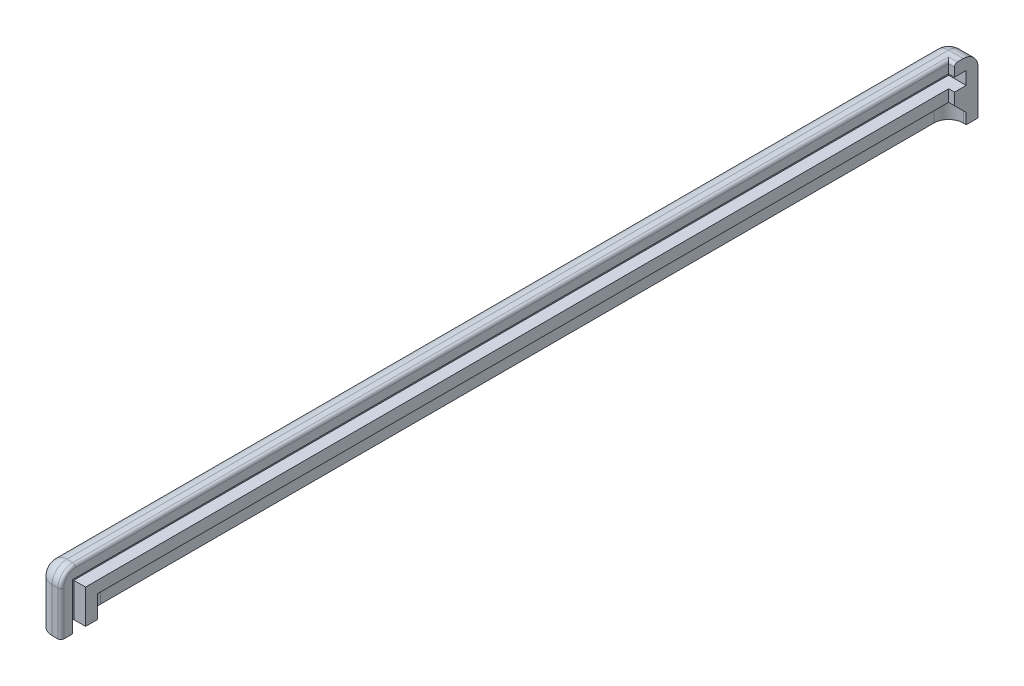
ISO-10303-21;
HEADER;
FILE_DESCRIPTION(('STEP AP214'),'2;1');
FILE_NAME('part.step','',(''),(''),'','','');
FILE_SCHEMA(('AUTOMOTIVE_DESIGN { 1 0 10303 214 1 1 1 1 }'));
ENDSEC;
DATA;
#1=APPLICATION_CONTEXT('core data for automotive mechanical design processes');
#2=APPLICATION_PROTOCOL_DEFINITION('international standard','automotive_design',2000,#1);
#3=PRODUCT_CONTEXT('',#1,'mechanical');
#4=PRODUCT('Part','Part','',(#3));
#5=PRODUCT_RELATED_PRODUCT_CATEGORY('part','',(#4));
#6=PRODUCT_DEFINITION_FORMATION('','',#4);
#7=PRODUCT_DEFINITION_CONTEXT('part definition',#1,'design');
#8=PRODUCT_DEFINITION('design','',#6,#7);
#9=PRODUCT_DEFINITION_SHAPE('','',#8);
#10=(LENGTH_UNIT() NAMED_UNIT(*) SI_UNIT(.MILLI.,.METRE.));
#11=(NAMED_UNIT(*) PLANE_ANGLE_UNIT() SI_UNIT($,.RADIAN.));
#12=(NAMED_UNIT(*) SI_UNIT($,.STERADIAN.) SOLID_ANGLE_UNIT());
#13=UNCERTAINTY_MEASURE_WITH_UNIT(LENGTH_MEASURE(1.E-05),#10,'distance_accuracy_value','');
#14=(GEOMETRIC_REPRESENTATION_CONTEXT(3) GLOBAL_UNCERTAINTY_ASSIGNED_CONTEXT((#13)) GLOBAL_UNIT_ASSIGNED_CONTEXT((#10,
#11,#12)) REPRESENTATION_CONTEXT('',''));
#15=CARTESIAN_POINT('',(0.,0.,0.));
#16=DIRECTION('',(0.,0.,1.));
#17=DIRECTION('',(1.,0.,0.));
#18=AXIS2_PLACEMENT_3D('',#15,#16,#17);
#19=CARTESIAN_POINT('',(-19.5,2.,-77.5));
#20=DIRECTION('',(0.,0.,1.));
#21=DIRECTION('',(1.,0.,0.));
#22=AXIS2_PLACEMENT_3D('',#19,#20,#21);
#23=PLANE('',#22);
#24=DIRECTION('',(1.,0.,0.));
#25=VECTOR('',#24,1.);
#26=CARTESIAN_POINT('',(-19.5,30.,-77.5));
#27=LINE('',#26,#25);
#28=CARTESIAN_POINT('',(-17.,30.,-77.5));
#29=VERTEX_POINT('',#28);
#30=CARTESIAN_POINT('',(-14.5,30.,-77.5));
#31=VERTEX_POINT('',#30);
#32=EDGE_CURVE('E96',#29,#31,#27,.T.);
#33=ORIENTED_EDGE('',*,*,#32,.F.);
#34=DIRECTION('',(0.,-1.,0.));
#35=VECTOR('',#34,1.);
#36=CARTESIAN_POINT('',(-17.,2.,-77.5));
#37=LINE('',#36,#35);
#38=CARTESIAN_POINT('',(-17.,37.5,-77.5));
#39=VERTEX_POINT('',#38);
#40=EDGE_CURVE('E266',#29,#39,#37,.F.);
#41=ORIENTED_EDGE('',*,*,#40,.T.);
#42=DIRECTION('',(-1.,0.,0.));
#43=VECTOR('',#42,1.);
#44=CARTESIAN_POINT('',(19.5,37.5,-77.5));
#45=LINE('',#44,#43);
#46=CARTESIAN_POINT('',(-14.5,37.5,-77.5));
#47=VERTEX_POINT('',#46);
#48=EDGE_CURVE('E277',#39,#47,#45,.F.);
#49=ORIENTED_EDGE('',*,*,#48,.T.);
#50=DIRECTION('',(0.,-1.,0.));
#51=VECTOR('',#50,1.);
#52=CARTESIAN_POINT('',(-14.5,2.,-77.5));
#53=LINE('',#52,#51);
#54=EDGE_CURVE('E268',#47,#31,#53,.T.);
#55=ORIENTED_EDGE('',*,*,#54,.T.);
#56=EDGE_LOOP('',(#33,#41,#49,#55));
#57=FACE_BOUND('',#56,.T.);
#58=ADVANCED_FACE('F82',(#57),#23,.F.);
#59=CARTESIAN_POINT('',(-17.5,42.8284271247462,75.5));
#60=DIRECTION('',(0.,0.,1.));
#61=DIRECTION('',(1.,0.,0.));
#62=AXIS2_PLACEMENT_3D('',#59,#60,#61);
#63=PLANE('',#62);
#64=DIRECTION('',(1.,0.,0.));
#65=VECTOR('',#64,1.);
#66=CARTESIAN_POINT('',(-17.5,30.,75.5));
#67=LINE('',#66,#65);
#68=CARTESIAN_POINT('',(-17.5,30.,75.5));
#69=VERTEX_POINT('',#68);
#70=CARTESIAN_POINT('',(-15.5,30.,75.5));
#71=VERTEX_POINT('',#70);
#72=EDGE_CURVE('E604',#69,#71,#67,.T.);
#73=ORIENTED_EDGE('',*,*,#72,.F.);
#74=DIRECTION('',(0.,-1.,0.));
#75=VECTOR('',#74,1.);
#76=CARTESIAN_POINT('',(-17.5,42.8284271247462,75.5));
#77=LINE('',#76,#75);
#78=CARTESIAN_POINT('',(-17.5,38.,75.5));
#79=VERTEX_POINT('',#78);
#80=EDGE_CURVE('E570',#79,#69,#77,.T.);
#81=ORIENTED_EDGE('',*,*,#80,.F.);
#82=DIRECTION('',(-1.,0.,0.));
#83=VECTOR('',#82,1.);
#84=CARTESIAN_POINT('',(-12.5267862505363,38.,75.5));
#85=LINE('',#84,#83);
#86=CARTESIAN_POINT('',(-15.5,38.,75.5));
#87=VERTEX_POINT('',#86);
#88=EDGE_CURVE('E322',#87,#79,#85,.T.);
#89=ORIENTED_EDGE('',*,*,#88,.F.);
#90=DIRECTION('',(0.,-1.,0.));
#91=VECTOR('',#90,1.);
#92=CARTESIAN_POINT('',(-15.5,42.8284271247462,75.5));
#93=LINE('',#92,#91);
#94=EDGE_CURVE('E571',#87,#71,#93,.T.);
#95=ORIENTED_EDGE('',*,*,#94,.T.);
#96=EDGE_LOOP('',(#73,#81,#89,#95));
#97=FACE_BOUND('',#96,.T.);
#98=ADVANCED_FACE('F417',(#97),#63,.F.);
#99=CARTESIAN_POINT('',(-19.5,2.,77.5));
#100=DIRECTION('',(0.,0.,-1.));
#101=DIRECTION('',(-1.,0.,0.));
#102=AXIS2_PLACEMENT_3D('',#99,#100,#101);
#103=PLANE('',#102);
#104=DIRECTION('',(1.,0.,0.));
#105=VECTOR('',#104,1.);
#106=CARTESIAN_POINT('',(-19.5,30.,77.5));
#107=LINE('',#106,#105);
#108=CARTESIAN_POINT('',(-17.,30.,77.5));
#109=VERTEX_POINT('',#108);
#110=CARTESIAN_POINT('',(-16.,30.,77.5));
#111=VERTEX_POINT('',#110);
#112=EDGE_CURVE('E269',#109,#111,#107,.T.);
#113=ORIENTED_EDGE('',*,*,#112,.T.);
#114=DIRECTION('',(0.,-1.,0.));
#115=VECTOR('',#114,1.);
#116=CARTESIAN_POINT('',(-16.,2.,77.5));
#117=LINE('',#116,#115);
#118=CARTESIAN_POINT('',(-16.,37.5,77.5));
#119=VERTEX_POINT('',#118);
#120=EDGE_CURVE('E90',#111,#119,#117,.F.);
#121=ORIENTED_EDGE('',*,*,#120,.T.);
#122=DIRECTION('',(1.,0.,0.));
#123=VECTOR('',#122,1.);
#124=CARTESIAN_POINT('',(-19.5,37.5,77.5));
#125=LINE('',#124,#123);
#126=CARTESIAN_POINT('',(-17.,37.5,77.5));
#127=VERTEX_POINT('',#126);
#128=EDGE_CURVE('E281',#119,#127,#125,.F.);
#129=ORIENTED_EDGE('',*,*,#128,.T.);
#130=DIRECTION('',(0.,-1.,0.));
#131=VECTOR('',#130,1.);
#132=CARTESIAN_POINT('',(-17.,2.,77.5));
#133=LINE('',#132,#131);
#134=EDGE_CURVE('E387',#127,#109,#133,.T.);
#135=ORIENTED_EDGE('',*,*,#134,.T.);
#136=EDGE_LOOP('',(#113,#121,#129,#135));
#137=FACE_BOUND('',#136,.T.);
#138=ADVANCED_FACE('F395',(#137),#103,.F.);
#139=CARTESIAN_POINT('',(-17.5,42.8284271247462,73.3));
#140=DIRECTION('',(0.,0.,-1.));
#141=DIRECTION('',(-1.,0.,0.));
#142=AXIS2_PLACEMENT_3D('',#139,#140,#141);
#143=PLANE('',#142);
#144=DIRECTION('',(-1.,0.,0.));
#145=VECTOR('',#144,1.);
#146=CARTESIAN_POINT('',(-17.5,30.,73.3));
#147=LINE('',#146,#145);
#148=CARTESIAN_POINT('',(-15.5,30.,73.3));
#149=VERTEX_POINT('',#148);
#150=CARTESIAN_POINT('',(-17.5,30.,73.3));
#151=VERTEX_POINT('',#150);
#152=EDGE_CURVE('E606',#149,#151,#147,.T.);
#153=ORIENTED_EDGE('',*,*,#152,.F.);
#154=DIRECTION('',(0.,-1.,0.));
#155=VECTOR('',#154,1.);
#156=CARTESIAN_POINT('',(-15.5,42.8284271247462,73.3));
#157=LINE('',#156,#155);
#158=CARTESIAN_POINT('',(-15.5,35.8,73.3));
#159=VERTEX_POINT('',#158);
#160=EDGE_CURVE('E567',#159,#149,#157,.T.);
#161=ORIENTED_EDGE('',*,*,#160,.F.);
#162=DIRECTION('',(-1.,0.,0.));
#163=VECTOR('',#162,1.);
#164=CARTESIAN_POINT('',(-15.5,35.8,73.3));
#165=LINE('',#164,#163);
#166=CARTESIAN_POINT('',(-17.5,35.8,73.3));
#167=VERTEX_POINT('',#166);
#168=EDGE_CURVE('E540',#159,#167,#165,.T.);
#169=ORIENTED_EDGE('',*,*,#168,.T.);
#170=DIRECTION('',(0.,-1.,0.));
#171=VECTOR('',#170,1.);
#172=CARTESIAN_POINT('',(-17.5,42.8284271247462,73.3));
#173=LINE('',#172,#171);
#174=EDGE_CURVE('E564',#167,#151,#173,.T.);
#175=ORIENTED_EDGE('',*,*,#174,.T.);
#176=EDGE_LOOP('',(#153,#161,#169,#175));
#177=FACE_BOUND('',#176,.T.);
#178=ADVANCED_FACE('F432',(#177),#143,.F.);
#179=CARTESIAN_POINT('',(0.,40.,-75.5));
#180=DIRECTION('',(0.,0.,-1.));
#181=DIRECTION('',(-1.,0.,0.));
#182=AXIS2_PLACEMENT_3D('',#179,#180,#181);
#183=PLANE('',#182);
#184=DIRECTION('',(-1.,0.,0.));
#185=VECTOR('',#184,1.);
#186=CARTESIAN_POINT('',(0.,30.,-75.5));
#187=LINE('',#186,#185);
#188=CARTESIAN_POINT('',(-14.5,30.,-75.5));
#189=VERTEX_POINT('',#188);
#190=CARTESIAN_POINT('',(-15.,30.,-75.5));
#191=VERTEX_POINT('',#190);
#192=EDGE_CURVE('E637',#189,#191,#187,.T.);
#193=ORIENTED_EDGE('',*,*,#192,.F.);
#194=DIRECTION('',(0.,1.,0.));
#195=VECTOR('',#194,1.);
#196=CARTESIAN_POINT('',(-14.5,40.,-75.5));
#197=LINE('',#196,#195);
#198=CARTESIAN_POINT('',(-14.5,31.8,-75.5));
#199=VERTEX_POINT('',#198);
#200=EDGE_CURVE('E620',#189,#199,#197,.T.);
#201=ORIENTED_EDGE('',*,*,#200,.T.);
#202=DIRECTION('',(-1.,0.,0.));
#203=VECTOR('',#202,1.);
#204=CARTESIAN_POINT('',(21.9721359549996,31.8,-75.5));
#205=LINE('',#204,#203);
#206=CARTESIAN_POINT('',(-15.,31.8,-75.5));
#207=VERTEX_POINT('',#206);
#208=EDGE_CURVE('E525',#199,#207,#205,.T.);
#209=ORIENTED_EDGE('',*,*,#208,.T.);
#210=DIRECTION('',(0.,-1.,0.));
#211=VECTOR('',#210,1.);
#212=CARTESIAN_POINT('',(-15.,40.,-75.5));
#213=LINE('',#212,#211);
#214=EDGE_CURVE('E297',#207,#191,#213,.T.);
#215=ORIENTED_EDGE('',*,*,#214,.T.);
#216=EDGE_LOOP('',(#193,#201,#209,#215));
#217=FACE_BOUND('',#216,.T.);
#218=ADVANCED_FACE('F445',(#217),#183,.F.);
#219=CARTESIAN_POINT('',(-15.,40.,-73.));
#220=DIRECTION('',(0.,-1.,0.));
#221=DIRECTION('',(0.,0.,-1.));
#222=AXIS2_PLACEMENT_3D('',#219,#220,#221);
#223=CYLINDRICAL_SURFACE('',#222,2.5);
#224=CARTESIAN_POINT('',(-15.,30.,-73.));
#225=DIRECTION('',(0.,-1.,0.));
#226=DIRECTION('',(0.,0.,-1.));
#227=AXIS2_PLACEMENT_3D('',#224,#225,#226);
#228=CIRCLE('',#227,2.5);
#229=CARTESIAN_POINT('',(-17.5,30.,-73.));
#230=VERTEX_POINT('',#229);
#231=EDGE_CURVE('E635',#191,#230,#228,.F.);
#232=ORIENTED_EDGE('',*,*,#231,.F.);
#233=ORIENTED_EDGE('',*,*,#214,.F.);
#234=CARTESIAN_POINT('',(-15.,34.3,-73.));
#235=DIRECTION('',(0.,0.707106781186546,-0.707106781186549));
#236=DIRECTION('',(0.,-0.707106781186549,-0.707106781186546));
#237=AXIS2_PLACEMENT_3D('',#234,#235,#236);
#238=ELLIPSE('',#237,3.53553390593274,2.5);
#239=CARTESIAN_POINT('',(-16.7677669529664,32.5322330470336,-74.7677669529664));
#240=VERTEX_POINT('',#239);
#241=EDGE_CURVE('E300',#240,#207,#238,.F.);
#242=ORIENTED_EDGE('',*,*,#241,.F.);
#243=CARTESIAN_POINT('',(-15.,34.3,-73.));
#244=DIRECTION('',(-0.707106781186551,0.707106781186544,0.));
#245=DIRECTION('',(-0.707106781186544,-0.707106781186551,0.));
#246=AXIS2_PLACEMENT_3D('',#243,#244,#245);
#247=ELLIPSE('',#246,3.53553390593276,2.5);
#248=CARTESIAN_POINT('',(-17.5,31.8,-73.));
#249=VERTEX_POINT('',#248);
#250=EDGE_CURVE('E293',#249,#240,#247,.F.);
#251=ORIENTED_EDGE('',*,*,#250,.F.);
#252=DIRECTION('',(0.,-1.,0.));
#253=VECTOR('',#252,1.);
#254=CARTESIAN_POINT('',(-17.5,40.,-73.));
#255=LINE('',#254,#253);
#256=EDGE_CURVE('E288',#230,#249,#255,.F.);
#257=ORIENTED_EDGE('',*,*,#256,.F.);
#258=EDGE_LOOP('',(#232,#233,#242,#251,#257));
#259=FACE_BOUND('',#258,.T.);
#260=ADVANCED_FACE('F437',(#259),#223,.F.);
#261=CARTESIAN_POINT('',(-17.5,40.,0.));
#262=DIRECTION('',(1.,0.,0.));
#263=DIRECTION('',(0.,0.,-1.));
#264=AXIS2_PLACEMENT_3D('',#261,#262,#263);
#265=PLANE('',#264);
#266=ORIENTED_EDGE('',*,*,#80,.T.);
#267=DIRECTION('',(0.,0.,-1.));
#268=VECTOR('',#267,1.);
#269=CARTESIAN_POINT('',(-17.5,30.,0.));
#270=LINE('',#269,#268);
#271=EDGE_CURVE('E605',#69,#151,#270,.T.);
#272=ORIENTED_EDGE('',*,*,#271,.T.);
#273=ORIENTED_EDGE('',*,*,#174,.F.);
#274=DIRECTION('',(0.,0.,-1.));
#275=VECTOR('',#274,1.);
#276=CARTESIAN_POINT('',(-17.5,35.8,81.9721359549996));
#277=LINE('',#276,#275);
#278=CARTESIAN_POINT('',(-17.5,35.8,-75.5));
#279=VERTEX_POINT('',#278);
#280=EDGE_CURVE('E554',#167,#279,#277,.T.);
#281=ORIENTED_EDGE('',*,*,#280,.T.);
#282=DIRECTION('',(0.,-1.,0.));
#283=VECTOR('',#282,1.);
#284=CARTESIAN_POINT('',(-17.5,40.,-75.5));
#285=LINE('',#284,#283);
#286=CARTESIAN_POINT('',(-17.5,38.,-75.5));
#287=VERTEX_POINT('',#286);
#288=EDGE_CURVE('E573',#287,#279,#285,.T.);
#289=ORIENTED_EDGE('',*,*,#288,.F.);
#290=DIRECTION('',(0.,0.,-1.));
#291=VECTOR('',#290,1.);
#292=CARTESIAN_POINT('',(-17.5,38.,81.9721359549996));
#293=LINE('',#292,#291);
#294=EDGE_CURVE('E562',#79,#287,#293,.T.);
#295=ORIENTED_EDGE('',*,*,#294,.F.);
#296=EDGE_LOOP('',(#266,#272,#273,#281,#289,#295));
#297=FACE_BOUND('',#296,.T.);
#298=ADVANCED_FACE('F433',(#297),#265,.T.);
#299=CARTESIAN_POINT('',(-15.5,42.8284271247462,77.5));
#300=DIRECTION('',(-1.,0.,0.));
#301=DIRECTION('',(0.,0.,1.));
#302=AXIS2_PLACEMENT_3D('',#299,#300,#301);
#303=PLANE('',#302);
#304=DIRECTION('',(0.,0.,1.));
#305=VECTOR('',#304,1.);
#306=CARTESIAN_POINT('',(-15.5,30.,77.5));
#307=LINE('',#306,#305);
#308=CARTESIAN_POINT('',(-15.5,30.,71.2494897427832));
#309=VERTEX_POINT('',#308);
#310=EDGE_CURVE('E610',#309,#149,#307,.T.);
#311=ORIENTED_EDGE('',*,*,#310,.F.);
#312=DIRECTION('',(0.,-1.,0.));
#313=VECTOR('',#312,1.);
#314=CARTESIAN_POINT('',(-15.5,4.,71.2494897427832));
#315=LINE('',#314,#313);
#316=CARTESIAN_POINT('',(-15.5,33.8,71.2494897427832));
#317=VERTEX_POINT('',#316);
#318=EDGE_CURVE('E303',#309,#317,#315,.F.);
#319=ORIENTED_EDGE('',*,*,#318,.T.);
#320=DIRECTION('',(0.,0.,-1.));
#321=VECTOR('',#320,1.);
#322=CARTESIAN_POINT('',(-15.5,33.8,81.9721359549996));
#323=LINE('',#322,#321);
#324=CARTESIAN_POINT('',(-15.5,33.8,-73.5));
#325=VERTEX_POINT('',#324);
#326=EDGE_CURVE('E548',#317,#325,#323,.T.);
#327=ORIENTED_EDGE('',*,*,#326,.T.);
#328=DIRECTION('',(0.,-1.,0.));
#329=VECTOR('',#328,1.);
#330=CARTESIAN_POINT('',(-15.5,42.8284271247451,-73.5000000000001));
#331=LINE('',#330,#329);
#332=CARTESIAN_POINT('',(-15.5,35.8,-73.5));
#333=VERTEX_POINT('',#332);
#334=EDGE_CURVE('E534',#333,#325,#331,.T.);
#335=ORIENTED_EDGE('',*,*,#334,.F.);
#336=DIRECTION('',(0.,0.,-1.));
#337=VECTOR('',#336,1.);
#338=CARTESIAN_POINT('',(-15.5,35.8,81.9721359549996));
#339=LINE('',#338,#337);
#340=EDGE_CURVE('E545',#159,#333,#339,.T.);
#341=ORIENTED_EDGE('',*,*,#340,.F.);
#342=ORIENTED_EDGE('',*,*,#160,.T.);
#343=EDGE_LOOP('',(#311,#319,#327,#335,#341,#342));
#344=FACE_BOUND('',#343,.T.);
#345=ADVANCED_FACE('F436',(#344),#303,.F.);
#346=DIRECTION('',(0.,0.,1.));
#347=VECTOR('',#346,1.);
#348=CARTESIAN_POINT('',(-15.5,30.,77.5));
#349=LINE('',#348,#347);
#350=CARTESIAN_POINT('',(-15.5,30.,77.));
#351=VERTEX_POINT('',#350);
#352=EDGE_CURVE('E359',#71,#351,#349,.T.);
#353=ORIENTED_EDGE('',*,*,#352,.F.);
#354=ORIENTED_EDGE('',*,*,#94,.F.);
#355=DIRECTION('',(0.,0.,-1.));
#356=VECTOR('',#355,1.);
#357=CARTESIAN_POINT('',(-15.5,38.,81.9721359549996));
#358=LINE('',#357,#356);
#359=CARTESIAN_POINT('',(-15.5,38.,-73.5));
#360=VERTEX_POINT('',#359);
#361=EDGE_CURVE('E560',#87,#360,#358,.T.);
#362=ORIENTED_EDGE('',*,*,#361,.T.);
#363=DIRECTION('',(0.,-1.,0.));
#364=VECTOR('',#363,1.);
#365=CARTESIAN_POINT('',(-15.5,42.8284271247451,-73.5));
#366=LINE('',#365,#364);
#367=CARTESIAN_POINT('',(-15.5,39.5,-73.5));
#368=VERTEX_POINT('',#367);
#369=EDGE_CURVE('E365',#368,#360,#366,.T.);
#370=ORIENTED_EDGE('',*,*,#369,.F.);
#371=DIRECTION('',(0.,0.,-1.));
#372=VECTOR('',#371,1.);
#373=CARTESIAN_POINT('',(-15.5,39.5,75.));
#374=LINE('',#373,#372);
#375=CARTESIAN_POINT('',(-15.5,39.5,75.));
#376=VERTEX_POINT('',#375);
#377=EDGE_CURVE('E332',#368,#376,#374,.F.);
#378=ORIENTED_EDGE('',*,*,#377,.T.);
#379=CARTESIAN_POINT('',(-15.5,37.5,75.));
#380=DIRECTION('',(-1.,0.,0.));
#381=DIRECTION('',(0.,0.,1.));
#382=AXIS2_PLACEMENT_3D('',#379,#380,#381);
#383=CIRCLE('',#382,2.);
#384=CARTESIAN_POINT('',(-15.5,37.5,77.));
#385=VERTEX_POINT('',#384);
#386=EDGE_CURVE('E330',#376,#385,#383,.F.);
#387=ORIENTED_EDGE('',*,*,#386,.T.);
#388=DIRECTION('',(0.,-1.,0.));
#389=VECTOR('',#388,1.);
#390=CARTESIAN_POINT('',(-15.5,42.8284271247462,77.));
#391=LINE('',#390,#389);
#392=EDGE_CURVE('E327',#385,#351,#391,.T.);
#393=ORIENTED_EDGE('',*,*,#392,.T.);
#394=EDGE_LOOP('',(#353,#354,#362,#370,#378,#387,#393));
#395=FACE_BOUND('',#394,.T.);
#396=ADVANCED_FACE('F357',(#395),#303,.F.);
#397=DIRECTION('',(0.,-1.,0.));
#398=VECTOR('',#397,1.);
#399=CARTESIAN_POINT('',(-17.5,40.,68.8));
#400=LINE('',#399,#398);
#401=CARTESIAN_POINT('',(-17.5,31.8,68.8));
#402=VERTEX_POINT('',#401);
#403=CARTESIAN_POINT('',(-17.5,30.,68.8));
#404=VERTEX_POINT('',#403);
#405=EDGE_CURVE('E290',#402,#404,#400,.T.);
#406=ORIENTED_EDGE('',*,*,#405,.T.);
#407=DIRECTION('',(0.,0.,-1.));
#408=VECTOR('',#407,1.);
#409=CARTESIAN_POINT('',(-17.5,30.,0.));
#410=LINE('',#409,#408);
#411=EDGE_CURVE('E632',#404,#230,#410,.T.);
#412=ORIENTED_EDGE('',*,*,#411,.T.);
#413=ORIENTED_EDGE('',*,*,#256,.T.);
#414=DIRECTION('',(0.,0.,-1.));
#415=VECTOR('',#414,1.);
#416=CARTESIAN_POINT('',(-17.5,31.8,81.9721359549996));
#417=LINE('',#416,#415);
#418=EDGE_CURVE('E551',#402,#249,#417,.T.);
#419=ORIENTED_EDGE('',*,*,#418,.F.);
#420=EDGE_LOOP('',(#406,#412,#413,#419));
#421=FACE_BOUND('',#420,.T.);
#422=ADVANCED_FACE('F428',(#421),#265,.T.);
#423=CARTESIAN_POINT('',(-19.5,2.,-77.5));
#424=DIRECTION('',(1.,0.,0.));
#425=DIRECTION('',(0.,0.,-1.));
#426=AXIS2_PLACEMENT_3D('',#423,#424,#425);
#427=PLANE('',#426);
#428=DIRECTION('',(0.,0.,-1.));
#429=VECTOR('',#428,1.);
#430=CARTESIAN_POINT('',(-19.5,30.,0.));
#431=LINE('',#430,#429);
#432=CARTESIAN_POINT('',(-19.5,30.,75.));
#433=VERTEX_POINT('',#432);
#434=CARTESIAN_POINT('',(-19.5,30.,-75.));
#435=VERTEX_POINT('',#434);
#436=EDGE_CURVE('E255',#433,#435,#431,.T.);
#437=ORIENTED_EDGE('',*,*,#436,.F.);
#438=DIRECTION('',(0.,-1.,0.));
#439=VECTOR('',#438,1.);
#440=CARTESIAN_POINT('',(-19.5,2.,75.));
#441=LINE('',#440,#439);
#442=CARTESIAN_POINT('',(-19.5,37.5,75.));
#443=VERTEX_POINT('',#442);
#444=EDGE_CURVE('E286',#433,#443,#441,.F.);
#445=ORIENTED_EDGE('',*,*,#444,.T.);
#446=DIRECTION('',(0.,0.,1.));
#447=VECTOR('',#446,1.);
#448=CARTESIAN_POINT('',(-19.5,37.5,-77.5));
#449=LINE('',#448,#447);
#450=CARTESIAN_POINT('',(-19.5,37.5,-75.));
#451=VERTEX_POINT('',#450);
#452=EDGE_CURVE('E279',#443,#451,#449,.F.);
#453=ORIENTED_EDGE('',*,*,#452,.T.);
#454=DIRECTION('',(0.,-1.,0.));
#455=VECTOR('',#454,1.);
#456=CARTESIAN_POINT('',(-19.5,2.,-75.));
#457=LINE('',#456,#455);
#458=EDGE_CURVE('E276',#451,#435,#457,.T.);
#459=ORIENTED_EDGE('',*,*,#458,.T.);
#460=EDGE_LOOP('',(#437,#445,#453,#459));
#461=FACE_BOUND('',#460,.T.);
#462=ADVANCED_FACE('F425',(#461),#427,.F.);
#463=CARTESIAN_POINT('',(-17.,2.,-75.));
#464=DIRECTION('',(0.,-1.,0.));
#465=DIRECTION('',(0.,0.,-1.));
#466=AXIS2_PLACEMENT_3D('',#463,#464,#465);
#467=CYLINDRICAL_SURFACE('',#466,2.5);
#468=ORIENTED_EDGE('',*,*,#40,.F.);
#469=CARTESIAN_POINT('',(-17.,30.,-75.));
#470=DIRECTION('',(0.,-1.,0.));
#471=DIRECTION('',(0.,0.,-1.));
#472=AXIS2_PLACEMENT_3D('',#469,#470,#471);
#473=CIRCLE('',#472,2.5);
#474=EDGE_CURVE('E252',#29,#435,#473,.F.);
#475=ORIENTED_EDGE('',*,*,#474,.T.);
#476=ORIENTED_EDGE('',*,*,#458,.F.);
#477=CARTESIAN_POINT('',(-17.,37.5,-75.));
#478=DIRECTION('',(0.,1.,0.));
#479=DIRECTION('',(0.,0.,1.));
#480=AXIS2_PLACEMENT_3D('',#477,#478,#479);
#481=CIRCLE('',#480,2.5);
#482=EDGE_CURVE('E274',#39,#451,#481,.T.);
#483=ORIENTED_EDGE('',*,*,#482,.F.);
#484=EDGE_LOOP('',(#468,#475,#476,#483));
#485=FACE_BOUND('',#484,.T.);
#486=ADVANCED_FACE('F272',(#485),#467,.T.);
#487=CARTESIAN_POINT('',(-17.,2.,75.));
#488=DIRECTION('',(0.,-1.,0.));
#489=DIRECTION('',(0.,0.,-1.));
#490=AXIS2_PLACEMENT_3D('',#487,#488,#489);
#491=CYLINDRICAL_SURFACE('',#490,2.5);
#492=ORIENTED_EDGE('',*,*,#444,.F.);
#493=CARTESIAN_POINT('',(-17.,30.,75.));
#494=DIRECTION('',(0.,-1.,0.));
#495=DIRECTION('',(0.,0.,-1.));
#496=AXIS2_PLACEMENT_3D('',#493,#494,#495);
#497=CIRCLE('',#496,2.5);
#498=EDGE_CURVE('E261',#433,#109,#497,.F.);
#499=ORIENTED_EDGE('',*,*,#498,.T.);
#500=ORIENTED_EDGE('',*,*,#134,.F.);
#501=CARTESIAN_POINT('',(-17.,37.5,75.));
#502=DIRECTION('',(0.,1.,0.));
#503=DIRECTION('',(0.,0.,1.));
#504=AXIS2_PLACEMENT_3D('',#501,#502,#503);
#505=CIRCLE('',#504,2.5);
#506=EDGE_CURVE('E313',#443,#127,#505,.T.);
#507=ORIENTED_EDGE('',*,*,#506,.F.);
#508=EDGE_LOOP('',(#492,#499,#500,#507));
#509=FACE_BOUND('',#508,.T.);
#510=ADVANCED_FACE('F400',(#509),#491,.T.);
#511=CARTESIAN_POINT('',(-15.,40.,68.8));
#512=DIRECTION('',(0.,-1.,0.));
#513=DIRECTION('',(0.,0.,-1.));
#514=AXIS2_PLACEMENT_3D('',#511,#512,#513);
#515=CYLINDRICAL_SURFACE('',#514,2.5);
#516=CARTESIAN_POINT('',(-15.,30.,68.8));
#517=DIRECTION('',(0.,-1.,0.));
#518=DIRECTION('',(0.,0.,-1.));
#519=AXIS2_PLACEMENT_3D('',#516,#517,#518);
#520=CIRCLE('',#519,2.5);
#521=EDGE_CURVE('E630',#404,#309,#520,.F.);
#522=ORIENTED_EDGE('',*,*,#521,.F.);
#523=ORIENTED_EDGE('',*,*,#405,.F.);
#524=CARTESIAN_POINT('',(-15.,34.3,68.8));
#525=DIRECTION('',(-0.707106781186551,0.707106781186544,0.));
#526=DIRECTION('',(-0.707106781186544,-0.707106781186551,0.));
#527=AXIS2_PLACEMENT_3D('',#524,#525,#526);
#528=ELLIPSE('',#527,3.53553390593276,2.5);
#529=EDGE_CURVE('E295',#317,#402,#528,.F.);
#530=ORIENTED_EDGE('',*,*,#529,.F.);
#531=ORIENTED_EDGE('',*,*,#318,.F.);
#532=EDGE_LOOP('',(#522,#523,#530,#531));
#533=FACE_BOUND('',#532,.T.);
#534=ADVANCED_FACE('F494',(#533),#515,.F.);
#535=CARTESIAN_POINT('',(-16.,42.8284271247462,77.));
#536=DIRECTION('',(0.,-1.,0.));
#537=DIRECTION('',(0.,0.,-1.));
#538=AXIS2_PLACEMENT_3D('',#535,#536,#537);
#539=CYLINDRICAL_SURFACE('',#538,0.5);
#540=ORIENTED_EDGE('',*,*,#120,.F.);
#541=CARTESIAN_POINT('',(-16.,30.,77.));
#542=DIRECTION('',(0.,-1.,0.));
#543=DIRECTION('',(0.,0.,-1.));
#544=AXIS2_PLACEMENT_3D('',#541,#542,#543);
#545=CIRCLE('',#544,0.5);
#546=EDGE_CURVE('E354',#111,#351,#545,.F.);
#547=ORIENTED_EDGE('',*,*,#546,.T.);
#548=ORIENTED_EDGE('',*,*,#392,.F.);
#549=CARTESIAN_POINT('',(-16.,37.5,77.));
#550=DIRECTION('',(0.,1.,0.));
#551=DIRECTION('',(0.,0.,1.));
#552=AXIS2_PLACEMENT_3D('',#549,#550,#551);
#553=CIRCLE('',#552,0.5);
#554=EDGE_CURVE('E310',#119,#385,#553,.T.);
#555=ORIENTED_EDGE('',*,*,#554,.F.);
#556=EDGE_LOOP('',(#540,#547,#548,#555));
#557=FACE_BOUND('',#556,.T.);
#558=ADVANCED_FACE('F84',(#557),#539,.T.);
#559=CARTESIAN_POINT('',(-14.5,9.,-77.5353460179952));
#560=DIRECTION('',(-1.,0.,0.));
#561=DIRECTION('',(0.,0.,1.));
#562=AXIS2_PLACEMENT_3D('',#559,#560,#561);
#563=PLANE('',#562);
#564=DIRECTION('',(0.,0.,1.));
#565=VECTOR('',#564,1.);
#566=CARTESIAN_POINT('',(-14.5,30.,-77.5353460179952));
#567=LINE('',#566,#565);
#568=EDGE_CURVE('E12',#31,#189,#567,.T.);
#569=ORIENTED_EDGE('',*,*,#568,.F.);
#570=ORIENTED_EDGE('',*,*,#54,.F.);
#571=CARTESIAN_POINT('',(-14.5,37.5,-75.));
#572=DIRECTION('',(-1.,0.,0.));
#573=DIRECTION('',(0.,-1.,0.));
#574=AXIS2_PLACEMENT_3D('',#571,#572,#573);
#575=CIRCLE('',#574,2.5);
#576=CARTESIAN_POINT('',(-14.5,40.,-75.));
#577=VERTEX_POINT('',#576);
#578=EDGE_CURVE('E516',#47,#577,#575,.F.);
#579=ORIENTED_EDGE('',*,*,#578,.T.);
#580=DIRECTION('',(0.,0.,1.));
#581=VECTOR('',#580,1.);
#582=CARTESIAN_POINT('',(-14.5,40.,-77.5353460179952));
#583=LINE('',#582,#581);
#584=CARTESIAN_POINT('',(-14.5,40.,-74.));
#585=VERTEX_POINT('',#584);
#586=EDGE_CURVE('E260',#577,#585,#583,.T.);
#587=ORIENTED_EDGE('',*,*,#586,.T.);
#588=CARTESIAN_POINT('',(-14.5,39.5,-74.));
#589=DIRECTION('',(-1.,0.,0.));
#590=DIRECTION('',(0.,-1.,0.));
#591=AXIS2_PLACEMENT_3D('',#588,#589,#590);
#592=CIRCLE('',#591,0.5);
#593=CARTESIAN_POINT('',(-14.5,39.5,-73.5));
#594=VERTEX_POINT('',#593);
#595=EDGE_CURVE('E375',#585,#594,#592,.F.);
#596=ORIENTED_EDGE('',*,*,#595,.T.);
#597=DIRECTION('',(0.,1.,0.));
#598=VECTOR('',#597,1.);
#599=CARTESIAN_POINT('',(-14.5,40.,-73.5));
#600=LINE('',#599,#598);
#601=CARTESIAN_POINT('',(-14.5,38.,-73.5));
#602=VERTEX_POINT('',#601);
#603=EDGE_CURVE('E519',#602,#594,#600,.T.);
#604=ORIENTED_EDGE('',*,*,#603,.F.);
#605=DIRECTION('',(0.,0.,1.));
#606=VECTOR('',#605,1.);
#607=CARTESIAN_POINT('',(-14.5,38.,81.9721359549996));
#608=LINE('',#607,#606);
#609=CARTESIAN_POINT('',(-14.5,38.,-75.5));
#610=VERTEX_POINT('',#609);
#611=EDGE_CURVE('E593',#610,#602,#608,.T.);
#612=ORIENTED_EDGE('',*,*,#611,.F.);
#613=DIRECTION('',(0.,1.,0.));
#614=VECTOR('',#613,1.);
#615=CARTESIAN_POINT('',(-14.5,40.,-75.5));
#616=LINE('',#615,#614);
#617=CARTESIAN_POINT('',(-14.5,35.8,-75.5));
#618=VERTEX_POINT('',#617);
#619=EDGE_CURVE('E590',#618,#610,#616,.T.);
#620=ORIENTED_EDGE('',*,*,#619,.F.);
#621=DIRECTION('',(0.,0.,-1.));
#622=VECTOR('',#621,1.);
#623=CARTESIAN_POINT('',(-14.5,35.8,81.9721359549996));
#624=LINE('',#623,#622);
#625=CARTESIAN_POINT('',(-14.5,35.8,-73.5));
#626=VERTEX_POINT('',#625);
#627=EDGE_CURVE('E588',#626,#618,#624,.T.);
#628=ORIENTED_EDGE('',*,*,#627,.F.);
#629=DIRECTION('',(0.,1.,0.));
#630=VECTOR('',#629,1.);
#631=CARTESIAN_POINT('',(-14.5,35.8,-73.5));
#632=LINE('',#631,#630);
#633=CARTESIAN_POINT('',(-14.5,33.8,-73.5));
#634=VERTEX_POINT('',#633);
#635=EDGE_CURVE('E591',#634,#626,#632,.T.);
#636=ORIENTED_EDGE('',*,*,#635,.F.);
#637=DIRECTION('',(0.,0.707106781186549,0.707106781186546));
#638=VECTOR('',#637,1.);
#639=CARTESIAN_POINT('',(-14.5,33.8,-73.5));
#640=LINE('',#639,#638);
#641=EDGE_CURVE('E595',#199,#634,#640,.T.);
#642=ORIENTED_EDGE('',*,*,#641,.F.);
#643=ORIENTED_EDGE('',*,*,#200,.F.);
#644=EDGE_LOOP('',(#569,#570,#579,#587,#596,#604,#612,#620,#628,#636,#642,#643));
#645=FACE_BOUND('',#644,.T.);
#646=ADVANCED_FACE('F443',(#645),#563,.F.);
#647=DIRECTION('',(-1.,0.,0.));
#648=VECTOR('',#647,1.);
#649=CARTESIAN_POINT('',(-15.5,35.8,-75.5));
#650=LINE('',#649,#648);
#651=EDGE_CURVE('E543',#618,#279,#650,.T.);
#652=ORIENTED_EDGE('',*,*,#651,.F.);
#653=ORIENTED_EDGE('',*,*,#619,.T.);
#654=DIRECTION('',(1.,0.,0.));
#655=VECTOR('',#654,1.);
#656=CARTESIAN_POINT('',(-15.5,38.,-75.5));
#657=LINE('',#656,#655);
#658=EDGE_CURVE('E557',#287,#610,#657,.T.);
#659=ORIENTED_EDGE('',*,*,#658,.F.);
#660=ORIENTED_EDGE('',*,*,#288,.T.);
#661=EDGE_LOOP('',(#652,#653,#659,#660));
#662=FACE_BOUND('',#661,.T.);
#663=ADVANCED_FACE('F439',(#662),#183,.F.);
#664=CARTESIAN_POINT('',(-15.5,33.8,81.9721359549996));
#665=DIRECTION('',(-0.707106781186551,0.707106781186544,0.));
#666=DIRECTION('',(-0.707106781186544,-0.707106781186551,0.));
#667=AXIS2_PLACEMENT_3D('',#664,#665,#666);
#668=PLANE('',#667);
#669=ORIENTED_EDGE('',*,*,#326,.F.);
#670=ORIENTED_EDGE('',*,*,#529,.T.);
#671=ORIENTED_EDGE('',*,*,#418,.T.);
#672=ORIENTED_EDGE('',*,*,#250,.T.);
#673=DIRECTION('',(-0.577350269189622,-0.577350269189629,-0.577350269189626));
#674=VECTOR('',#673,1.);
#675=CARTESIAN_POINT('',(36.3240453183329,85.6240453183335,-21.6759546816666));
#676=LINE('',#675,#674);
#677=EDGE_CURVE('E530',#325,#240,#676,.T.);
#678=ORIENTED_EDGE('',*,*,#677,.F.);
#679=EDGE_LOOP('',(#669,#670,#671,#672,#678));
#680=FACE_BOUND('',#679,.T.);
#681=ADVANCED_FACE('F442',(#680),#668,.F.);
#682=CARTESIAN_POINT('',(0.,40.,0.));
#683=DIRECTION('',(0.,1.,0.));
#684=DIRECTION('',(0.,0.,1.));
#685=AXIS2_PLACEMENT_3D('',#682,#683,#684);
#686=PLANE('',#685);
#687=ORIENTED_EDGE('',*,*,#586,.F.);
#688=DIRECTION('',(-1.,0.,0.));
#689=VECTOR('',#688,1.);
#690=CARTESIAN_POINT('',(-19.5,40.,-75.));
#691=LINE('',#690,#689);
#692=CARTESIAN_POINT('',(-17.,40.,-75.));
#693=VERTEX_POINT('',#692);
#694=EDGE_CURVE('E391',#577,#693,#691,.T.);
#695=ORIENTED_EDGE('',*,*,#694,.T.);
#696=DIRECTION('',(0.,0.,1.));
#697=VECTOR('',#696,1.);
#698=CARTESIAN_POINT('',(-17.,40.,77.5));
#699=LINE('',#698,#697);
#700=CARTESIAN_POINT('',(-17.,40.,75.));
#701=VERTEX_POINT('',#700);
#702=EDGE_CURVE('E384',#693,#701,#699,.T.);
#703=ORIENTED_EDGE('',*,*,#702,.T.);
#704=DIRECTION('',(1.,0.,0.));
#705=VECTOR('',#704,1.);
#706=CARTESIAN_POINT('',(-15.5,40.,75.));
#707=LINE('',#706,#705);
#708=CARTESIAN_POINT('',(-16.,40.,75.));
#709=VERTEX_POINT('',#708);
#710=EDGE_CURVE('E382',#701,#709,#707,.T.);
#711=ORIENTED_EDGE('',*,*,#710,.T.);
#712=DIRECTION('',(0.,0.,-1.));
#713=VECTOR('',#712,1.);
#714=CARTESIAN_POINT('',(-16.,40.,-73.5));
#715=LINE('',#714,#713);
#716=CARTESIAN_POINT('',(-16.,40.,-74.));
#717=VERTEX_POINT('',#716);
#718=EDGE_CURVE('E325',#709,#717,#715,.T.);
#719=ORIENTED_EDGE('',*,*,#718,.T.);
#720=DIRECTION('',(-1.,0.,0.));
#721=VECTOR('',#720,1.);
#722=CARTESIAN_POINT('',(15.5,40.,-74.));
#723=LINE('',#722,#721);
#724=EDGE_CURVE('E305',#717,#585,#723,.F.);
#725=ORIENTED_EDGE('',*,*,#724,.T.);
#726=EDGE_LOOP('',(#687,#695,#703,#711,#719,#725));
#727=FACE_BOUND('',#726,.T.);
#728=ADVANCED_FACE('F378',(#727),#686,.T.);
#729=CARTESIAN_POINT('',(15.5,35.8,81.9721359549996));
#730=DIRECTION('',(0.,-1.,0.));
#731=DIRECTION('',(0.,0.,-1.));
#732=AXIS2_PLACEMENT_3D('',#729,#730,#731);
#733=PLANE('',#732);
#734=DIRECTION('',(-1.,0.,0.));
#735=VECTOR('',#734,1.);
#736=CARTESIAN_POINT('',(21.9721359549996,35.8,-73.5));
#737=LINE('',#736,#735);
#738=EDGE_CURVE('E526',#626,#333,#737,.T.);
#739=ORIENTED_EDGE('',*,*,#738,.F.);
#740=ORIENTED_EDGE('',*,*,#627,.T.);
#741=ORIENTED_EDGE('',*,*,#651,.T.);
#742=ORIENTED_EDGE('',*,*,#280,.F.);
#743=ORIENTED_EDGE('',*,*,#168,.F.);
#744=ORIENTED_EDGE('',*,*,#340,.T.);
#745=EDGE_LOOP('',(#739,#740,#741,#742,#743,#744));
#746=FACE_BOUND('',#745,.T.);
#747=ADVANCED_FACE('F448',(#746),#733,.F.);
#748=CARTESIAN_POINT('',(15.5,38.,81.9721359549996));
#749=DIRECTION('',(0.,1.,0.));
#750=DIRECTION('',(0.,0.,1.));
#751=AXIS2_PLACEMENT_3D('',#748,#749,#750);
#752=PLANE('',#751);
#753=ORIENTED_EDGE('',*,*,#658,.T.);
#754=ORIENTED_EDGE('',*,*,#611,.T.);
#755=DIRECTION('',(-1.,0.,0.));
#756=VECTOR('',#755,1.);
#757=CARTESIAN_POINT('',(21.9721359549996,38.,-73.5));
#758=LINE('',#757,#756);
#759=EDGE_CURVE('E537',#602,#360,#758,.T.);
#760=ORIENTED_EDGE('',*,*,#759,.T.);
#761=ORIENTED_EDGE('',*,*,#361,.F.);
#762=ORIENTED_EDGE('',*,*,#88,.T.);
#763=ORIENTED_EDGE('',*,*,#294,.T.);
#764=EDGE_LOOP('',(#753,#754,#760,#761,#762,#763));
#765=FACE_BOUND('',#764,.T.);
#766=ADVANCED_FACE('F460',(#765),#752,.F.);
#767=CARTESIAN_POINT('',(21.9721359549996,40.,-73.5));
#768=DIRECTION('',(0.,0.,-1.));
#769=DIRECTION('',(0.,1.,0.));
#770=AXIS2_PLACEMENT_3D('',#767,#768,#769);
#771=PLANE('',#770);
#772=ORIENTED_EDGE('',*,*,#759,.F.);
#773=ORIENTED_EDGE('',*,*,#603,.T.);
#774=DIRECTION('',(-1.,0.,0.));
#775=VECTOR('',#774,1.);
#776=CARTESIAN_POINT('',(-15.5,39.5,-73.5));
#777=LINE('',#776,#775);
#778=EDGE_CURVE('E336',#594,#368,#777,.T.);
#779=ORIENTED_EDGE('',*,*,#778,.T.);
#780=ORIENTED_EDGE('',*,*,#369,.T.);
#781=EDGE_LOOP('',(#772,#773,#779,#780));
#782=FACE_BOUND('',#781,.T.);
#783=ADVANCED_FACE('F464',(#782),#771,.F.);
#784=CARTESIAN_POINT('',(21.9721359549996,35.8,-73.5));
#785=DIRECTION('',(0.,0.,-1.));
#786=DIRECTION('',(0.,1.,0.));
#787=AXIS2_PLACEMENT_3D('',#784,#785,#786);
#788=PLANE('',#787);
#789=DIRECTION('',(-1.,0.,0.));
#790=VECTOR('',#789,1.);
#791=CARTESIAN_POINT('',(21.9721359549996,33.8,-73.5));
#792=LINE('',#791,#790);
#793=EDGE_CURVE('E528',#634,#325,#792,.T.);
#794=ORIENTED_EDGE('',*,*,#793,.F.);
#795=ORIENTED_EDGE('',*,*,#635,.T.);
#796=ORIENTED_EDGE('',*,*,#738,.T.);
#797=ORIENTED_EDGE('',*,*,#334,.T.);
#798=EDGE_LOOP('',(#794,#795,#796,#797));
#799=FACE_BOUND('',#798,.T.);
#800=ADVANCED_FACE('F468',(#799),#788,.F.);
#801=CARTESIAN_POINT('',(21.9721359549996,33.8,-73.5));
#802=DIRECTION('',(0.,0.707106781186546,-0.707106781186549));
#803=DIRECTION('',(0.,0.707106781186549,0.707106781186546));
#804=AXIS2_PLACEMENT_3D('',#801,#802,#803);
#805=PLANE('',#804);
#806=ORIENTED_EDGE('',*,*,#208,.F.);
#807=ORIENTED_EDGE('',*,*,#641,.T.);
#808=ORIENTED_EDGE('',*,*,#793,.T.);
#809=ORIENTED_EDGE('',*,*,#677,.T.);
#810=ORIENTED_EDGE('',*,*,#241,.T.);
#811=EDGE_LOOP('',(#806,#807,#808,#809,#810));
#812=FACE_BOUND('',#811,.T.);
#813=ADVANCED_FACE('F472',(#812),#805,.F.);
#814=CARTESIAN_POINT('',(0.,37.5,-75.));
#815=DIRECTION('',(1.,0.,0.));
#816=DIRECTION('',(0.,0.,-1.));
#817=AXIS2_PLACEMENT_3D('',#814,#815,#816);
#818=CYLINDRICAL_SURFACE('',#817,2.5);
#819=ORIENTED_EDGE('',*,*,#578,.F.);
#820=ORIENTED_EDGE('',*,*,#48,.F.);
#821=CARTESIAN_POINT('',(-17.,37.5,-75.));
#822=DIRECTION('',(-1.,0.,0.));
#823=DIRECTION('',(0.,0.,1.));
#824=AXIS2_PLACEMENT_3D('',#821,#822,#823);
#825=CIRCLE('',#824,2.5);
#826=EDGE_CURVE('E319',#693,#39,#825,.T.);
#827=ORIENTED_EDGE('',*,*,#826,.F.);
#828=ORIENTED_EDGE('',*,*,#694,.F.);
#829=EDGE_LOOP('',(#819,#820,#827,#828));
#830=FACE_BOUND('',#829,.T.);
#831=ADVANCED_FACE('F476',(#830),#818,.T.);
#832=CARTESIAN_POINT('',(-17.,37.5,-75.));
#833=DIRECTION('',(0.,0.,1.));
#834=DIRECTION('',(1.,0.,0.));
#835=AXIS2_PLACEMENT_3D('',#832,#833,#834);
#836=SPHERICAL_SURFACE('',#835,2.5);
#837=ORIENTED_EDGE('',*,*,#826,.T.);
#838=ORIENTED_EDGE('',*,*,#482,.T.);
#839=CARTESIAN_POINT('',(-17.,37.5,-75.));
#840=DIRECTION('',(0.,0.,-1.));
#841=DIRECTION('',(-1.,0.,0.));
#842=AXIS2_PLACEMENT_3D('',#839,#840,#841);
#843=CIRCLE('',#842,2.5);
#844=EDGE_CURVE('E316',#693,#451,#843,.F.);
#845=ORIENTED_EDGE('',*,*,#844,.F.);
#846=EDGE_LOOP('',(#837,#838,#845));
#847=FACE_BOUND('',#846,.T.);
#848=ADVANCED_FACE('F501',(#847),#836,.T.);
#849=CARTESIAN_POINT('',(-17.,37.5,0.));
#850=DIRECTION('',(0.,0.,-1.));
#851=DIRECTION('',(-1.,0.,0.));
#852=AXIS2_PLACEMENT_3D('',#849,#850,#851);
#853=CYLINDRICAL_SURFACE('',#852,2.5);
#854=ORIENTED_EDGE('',*,*,#844,.T.);
#855=ORIENTED_EDGE('',*,*,#452,.F.);
#856=CARTESIAN_POINT('',(-17.,37.5,75.));
#857=DIRECTION('',(0.,0.,1.));
#858=DIRECTION('',(1.,0.,0.));
#859=AXIS2_PLACEMENT_3D('',#856,#857,#858);
#860=CIRCLE('',#859,2.5);
#861=EDGE_CURVE('E309',#701,#443,#860,.T.);
#862=ORIENTED_EDGE('',*,*,#861,.F.);
#863=ORIENTED_EDGE('',*,*,#702,.F.);
#864=EDGE_LOOP('',(#854,#855,#862,#863));
#865=FACE_BOUND('',#864,.T.);
#866=ADVANCED_FACE('F413',(#865),#853,.T.);
#867=CARTESIAN_POINT('',(-17.,37.5,75.));
#868=DIRECTION('',(0.,0.,1.));
#869=DIRECTION('',(1.,0.,0.));
#870=AXIS2_PLACEMENT_3D('',#867,#868,#869);
#871=SPHERICAL_SURFACE('',#870,2.5);
#872=ORIENTED_EDGE('',*,*,#861,.T.);
#873=ORIENTED_EDGE('',*,*,#506,.T.);
#874=CARTESIAN_POINT('',(-17.,37.5,75.));
#875=DIRECTION('',(-1.,0.,0.));
#876=DIRECTION('',(0.,0.,1.));
#877=AXIS2_PLACEMENT_3D('',#874,#875,#876);
#878=CIRCLE('',#877,2.5);
#879=EDGE_CURVE('E306',#701,#127,#878,.F.);
#880=ORIENTED_EDGE('',*,*,#879,.F.);
#881=EDGE_LOOP('',(#872,#873,#880));
#882=FACE_BOUND('',#881,.T.);
#883=ADVANCED_FACE('F403',(#882),#871,.T.);
#884=CARTESIAN_POINT('',(0.,37.5,75.));
#885=DIRECTION('',(-1.,0.,0.));
#886=DIRECTION('',(0.,0.,1.));
#887=AXIS2_PLACEMENT_3D('',#884,#885,#886);
#888=CYLINDRICAL_SURFACE('',#887,2.5);
#889=ORIENTED_EDGE('',*,*,#128,.F.);
#890=CARTESIAN_POINT('',(-16.,37.5,75.));
#891=DIRECTION('',(-1.,0.,0.));
#892=DIRECTION('',(0.,0.,1.));
#893=AXIS2_PLACEMENT_3D('',#890,#891,#892);
#894=CIRCLE('',#893,2.5);
#895=EDGE_CURVE('E334',#119,#709,#894,.T.);
#896=ORIENTED_EDGE('',*,*,#895,.T.);
#897=ORIENTED_EDGE('',*,*,#710,.F.);
#898=ORIENTED_EDGE('',*,*,#879,.T.);
#899=EDGE_LOOP('',(#889,#896,#897,#898));
#900=FACE_BOUND('',#899,.T.);
#901=ADVANCED_FACE('F404',(#900),#888,.T.);
#902=CARTESIAN_POINT('',(-16.,37.5,75.));
#903=DIRECTION('',(-1.,0.,0.));
#904=DIRECTION('',(0.,0.,1.));
#905=AXIS2_PLACEMENT_3D('',#902,#903,#904);
#906=TOROIDAL_SURFACE('',#905,2.,0.5);
#907=ORIENTED_EDGE('',*,*,#554,.T.);
#908=ORIENTED_EDGE('',*,*,#386,.F.);
#909=CARTESIAN_POINT('',(-16.,39.5,75.));
#910=DIRECTION('',(0.,0.,-1.));
#911=DIRECTION('',(-1.,0.,0.));
#912=AXIS2_PLACEMENT_3D('',#909,#910,#911);
#913=CIRCLE('',#912,0.5);
#914=EDGE_CURVE('E342',#709,#376,#913,.T.);
#915=ORIENTED_EDGE('',*,*,#914,.F.);
#916=ORIENTED_EDGE('',*,*,#895,.F.);
#917=EDGE_LOOP('',(#907,#908,#915,#916));
#918=FACE_BOUND('',#917,.T.);
#919=ADVANCED_FACE('F349',(#918),#906,.T.);
#920=CARTESIAN_POINT('',(-16.,39.5,0.));
#921=DIRECTION('',(0.,0.,1.));
#922=DIRECTION('',(1.,0.,0.));
#923=AXIS2_PLACEMENT_3D('',#920,#921,#922);
#924=CYLINDRICAL_SURFACE('',#923,0.5);
#925=ORIENTED_EDGE('',*,*,#914,.T.);
#926=ORIENTED_EDGE('',*,*,#377,.F.);
#927=CARTESIAN_POINT('',(-16.,39.5,-74.));
#928=DIRECTION('',(-0.707106781186547,0.,0.707106781186547));
#929=DIRECTION('',(0.707106781186547,0.,0.707106781186547));
#930=AXIS2_PLACEMENT_3D('',#927,#928,#929);
#931=ELLIPSE('',#930,0.707106781186547,0.5);
#932=EDGE_CURVE('E339',#717,#368,#931,.F.);
#933=ORIENTED_EDGE('',*,*,#932,.F.);
#934=ORIENTED_EDGE('',*,*,#718,.F.);
#935=EDGE_LOOP('',(#925,#926,#933,#934));
#936=FACE_BOUND('',#935,.T.);
#937=ADVANCED_FACE('F368',(#936),#924,.T.);
#938=CARTESIAN_POINT('',(21.9721359549996,39.5,-74.));
#939=DIRECTION('',(1.,0.,0.));
#940=DIRECTION('',(0.,0.,-1.));
#941=AXIS2_PLACEMENT_3D('',#938,#939,#940);
#942=CYLINDRICAL_SURFACE('',#941,0.5);
#943=ORIENTED_EDGE('',*,*,#595,.F.);
#944=ORIENTED_EDGE('',*,*,#724,.F.);
#945=ORIENTED_EDGE('',*,*,#932,.T.);
#946=ORIENTED_EDGE('',*,*,#778,.F.);
#947=EDGE_LOOP('',(#943,#944,#945,#946));
#948=FACE_BOUND('',#947,.T.);
#949=ADVANCED_FACE('F374',(#948),#942,.T.);
#950=CARTESIAN_POINT('',(-19.5,30.,0.));
#951=DIRECTION('',(0.,-1.,0.));
#952=DIRECTION('',(0.,0.,-1.));
#953=AXIS2_PLACEMENT_3D('',#950,#951,#952);
#954=PLANE('',#953);
#955=ORIENTED_EDGE('',*,*,#32,.T.);
#956=ORIENTED_EDGE('',*,*,#568,.T.);
#957=ORIENTED_EDGE('',*,*,#192,.T.);
#958=ORIENTED_EDGE('',*,*,#231,.T.);
#959=ORIENTED_EDGE('',*,*,#411,.F.);
#960=ORIENTED_EDGE('',*,*,#521,.T.);
#961=ORIENTED_EDGE('',*,*,#310,.T.);
#962=ORIENTED_EDGE('',*,*,#152,.T.);
#963=ORIENTED_EDGE('',*,*,#271,.F.);
#964=ORIENTED_EDGE('',*,*,#72,.T.);
#965=ORIENTED_EDGE('',*,*,#352,.T.);
#966=ORIENTED_EDGE('',*,*,#546,.F.);
#967=ORIENTED_EDGE('',*,*,#112,.F.);
#968=ORIENTED_EDGE('',*,*,#498,.F.);
#969=ORIENTED_EDGE('',*,*,#436,.T.);
#970=ORIENTED_EDGE('',*,*,#474,.F.);
#971=EDGE_LOOP('',(#955,#956,#957,#958,#959,#960,#961,#962,#963,#964,#965,#966,#967,#968,#969,#970));
#972=FACE_BOUND('',#971,.T.);
#973=ADVANCED_FACE('F253',(#972),#954,.T.);
#974=CLOSED_SHELL('',(#58,#98,#138,#178,#218,#260,#298,#345,#396,#422,#462,#486,#510,#534,#558,
#646,#663,#681,#728,#747,#766,#783,#800,#813,#831,#848,#866,#883,#901,#919,#937,#949,#973));
#975=MANIFOLD_SOLID_BREP('B2',#974);
#976=ADVANCED_BREP_SHAPE_REPRESENTATION('',(#18,#975),#14);
#977=SHAPE_DEFINITION_REPRESENTATION(#9,#976);
ENDSEC;
END-ISO-10303-21;
